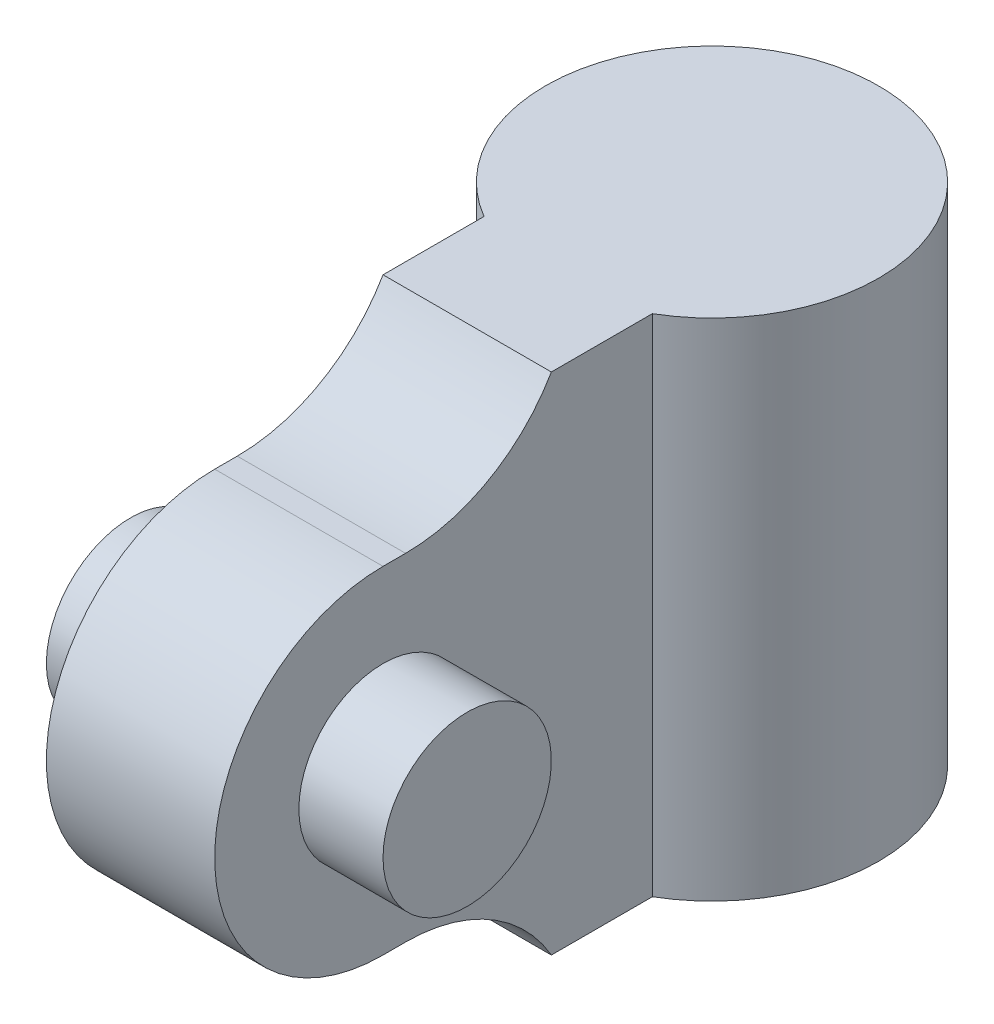
ISO-10303-21;
HEADER;
FILE_DESCRIPTION(('STEP AP214'),'2;1');
FILE_NAME('part.step','',(''),(''),'','','');
FILE_SCHEMA(('AUTOMOTIVE_DESIGN { 1 0 10303 214 1 1 1 1 }'));
ENDSEC;
DATA;
#1=APPLICATION_CONTEXT('core data for automotive mechanical design processes');
#2=APPLICATION_PROTOCOL_DEFINITION('international standard','automotive_design',2000,#1);
#3=PRODUCT_CONTEXT('',#1,'mechanical');
#4=PRODUCT('Part','Part','',(#3));
#5=PRODUCT_RELATED_PRODUCT_CATEGORY('part','',(#4));
#6=PRODUCT_DEFINITION_FORMATION('','',#4);
#7=PRODUCT_DEFINITION_CONTEXT('part definition',#1,'design');
#8=PRODUCT_DEFINITION('design','',#6,#7);
#9=PRODUCT_DEFINITION_SHAPE('','',#8);
#10=(LENGTH_UNIT() NAMED_UNIT(*) SI_UNIT(.MILLI.,.METRE.));
#11=(NAMED_UNIT(*) PLANE_ANGLE_UNIT() SI_UNIT($,.RADIAN.));
#12=(NAMED_UNIT(*) SI_UNIT($,.STERADIAN.) SOLID_ANGLE_UNIT());
#13=UNCERTAINTY_MEASURE_WITH_UNIT(LENGTH_MEASURE(1.E-05),#10,'distance_accuracy_value','');
#14=(GEOMETRIC_REPRESENTATION_CONTEXT(3) GLOBAL_UNCERTAINTY_ASSIGNED_CONTEXT((#13)) GLOBAL_UNIT_ASSIGNED_CONTEXT((#10,
#11,#12)) REPRESENTATION_CONTEXT('',''));
#15=CARTESIAN_POINT('',(0.,0.,0.));
#16=DIRECTION('',(0.,0.,1.));
#17=DIRECTION('',(1.,0.,0.));
#18=AXIS2_PLACEMENT_3D('',#15,#16,#17);
#19=CARTESIAN_POINT('',(-2.5,-15.,5.7722944655068));
#20=DIRECTION('',(-1.,0.,0.));
#21=DIRECTION('',(0.,0.,1.));
#22=AXIS2_PLACEMENT_3D('',#19,#20,#21);
#23=PLANE('',#22);
#24=CARTESIAN_POINT('',(-2.5,-7.5,12.2722944655068));
#25=DIRECTION('',(-1.,0.,0.));
#26=DIRECTION('',(0.,0.,1.));
#27=AXIS2_PLACEMENT_3D('',#24,#25,#26);
#28=CIRCLE('',#27,2.5);
#29=CARTESIAN_POINT('',(-2.5,-7.5,14.7722944655068));
#30=VERTEX_POINT('',#29);
#31=EDGE_CURVE('E53',#30,#30,#28,.T.);
#32=ORIENTED_EDGE('',*,*,#31,.F.);
#33=EDGE_LOOP('',(#32));
#34=FACE_BOUND('',#33,.T.);
#35=DIRECTION('',(0.,0.,-1.));
#36=VECTOR('',#35,1.);
#37=CARTESIAN_POINT('',(-2.5,-12.5,17.2722944655068));
#38=LINE('',#37,#36);
#39=CARTESIAN_POINT('',(-2.5,-12.5,12.2722944655068));
#40=VERTEX_POINT('',#39);
#41=CARTESIAN_POINT('',(-2.5,-12.5,11.602421484429));
#42=VERTEX_POINT('',#41);
#43=EDGE_CURVE('E60',#40,#42,#38,.T.);
#44=ORIENTED_EDGE('',*,*,#43,.F.);
#45=CARTESIAN_POINT('',(-2.5,-7.5,12.2722944655068));
#46=DIRECTION('',(-1.,0.,0.));
#47=DIRECTION('',(0.,0.,1.));
#48=AXIS2_PLACEMENT_3D('',#45,#46,#47);
#49=CIRCLE('',#48,5.);
#50=CARTESIAN_POINT('',(-2.5,-2.5,12.2722944655068));
#51=VERTEX_POINT('',#50);
#52=EDGE_CURVE('E65',#40,#51,#49,.T.);
#53=ORIENTED_EDGE('',*,*,#52,.T.);
#54=DIRECTION('',(0.,0.,-1.));
#55=VECTOR('',#54,1.);
#56=CARTESIAN_POINT('',(-2.5,-2.5,17.2722944655068));
#57=LINE('',#56,#55);
#58=CARTESIAN_POINT('',(-2.5,-2.5,11.602421484429));
#59=VERTEX_POINT('',#58);
#60=EDGE_CURVE('E125',#51,#59,#57,.T.);
#61=ORIENTED_EDGE('',*,*,#60,.T.);
#62=CARTESIAN_POINT('',(-2.5,2.5,11.602421484429));
#63=DIRECTION('',(-1.,0.,0.));
#64=DIRECTION('',(0.,0.,1.));
#65=AXIS2_PLACEMENT_3D('',#62,#63,#64);
#66=CIRCLE('',#65,5.);
#67=CARTESIAN_POINT('',(-2.5,0.,7.2722944655068));
#68=VERTEX_POINT('',#67);
#69=EDGE_CURVE('E278',#59,#68,#66,.F.);
#70=ORIENTED_EDGE('',*,*,#69,.T.);
#71=DIRECTION('',(0.,0.,1.));
#72=VECTOR('',#71,1.);
#73=CARTESIAN_POINT('',(-2.5,0.,5.7722944655068));
#74=LINE('',#73,#72);
#75=CARTESIAN_POINT('',(-2.5,0.,4.27229446550679));
#76=VERTEX_POINT('',#75);
#77=EDGE_CURVE('E281',#76,#68,#74,.T.);
#78=ORIENTED_EDGE('',*,*,#77,.F.);
#79=DIRECTION('',(0.,1.,0.));
#80=VECTOR('',#79,1.);
#81=CARTESIAN_POINT('',(-2.5,-15.,4.27229446550679));
#82=LINE('',#81,#80);
#83=CARTESIAN_POINT('',(-2.5,-15.,4.27229446550679));
#84=VERTEX_POINT('',#83);
#85=EDGE_CURVE('E286',#84,#76,#82,.T.);
#86=ORIENTED_EDGE('',*,*,#85,.F.);
#87=DIRECTION('',(0.,0.,1.));
#88=VECTOR('',#87,1.);
#89=CARTESIAN_POINT('',(-2.5,-15.,5.7722944655068));
#90=LINE('',#89,#88);
#91=CARTESIAN_POINT('',(-2.5,-15.,7.2722944655068));
#92=VERTEX_POINT('',#91);
#93=EDGE_CURVE('E290',#84,#92,#90,.T.);
#94=ORIENTED_EDGE('',*,*,#93,.T.);
#95=CARTESIAN_POINT('',(-2.5,-17.5,11.602421484429));
#96=DIRECTION('',(-1.,0.,0.));
#97=DIRECTION('',(0.,0.,1.));
#98=AXIS2_PLACEMENT_3D('',#95,#96,#97);
#99=CIRCLE('',#98,5.);
#100=EDGE_CURVE('E301',#92,#42,#99,.F.);
#101=ORIENTED_EDGE('',*,*,#100,.T.);
#102=EDGE_LOOP('',(#44,#53,#61,#70,#78,#86,#94,#101));
#103=FACE_BOUND('',#102,.T.);
#104=ADVANCED_FACE('F46',(#34,#103),#23,.T.);
#105=CARTESIAN_POINT('',(0.,-15.,0.));
#106=DIRECTION('',(0.,1.,0.));
#107=DIRECTION('',(0.,0.,1.));
#108=AXIS2_PLACEMENT_3D('',#105,#106,#107);
#109=CYLINDRICAL_SURFACE('',#108,4.95);
#110=CARTESIAN_POINT('',(0.,0.,0.));
#111=DIRECTION('',(0.,-1.,0.));
#112=DIRECTION('',(0.,0.,-1.));
#113=AXIS2_PLACEMENT_3D('',#110,#111,#112);
#114=CIRCLE('',#113,4.95);
#115=CARTESIAN_POINT('',(2.5,0.,4.27229446550679));
#116=VERTEX_POINT('',#115);
#117=EDGE_CURVE('E298',#76,#116,#114,.T.);
#118=ORIENTED_EDGE('',*,*,#117,.T.);
#119=DIRECTION('',(0.,1.,0.));
#120=VECTOR('',#119,1.);
#121=CARTESIAN_POINT('',(2.5,-15.,4.27229446550679));
#122=LINE('',#121,#120);
#123=CARTESIAN_POINT('',(2.5,-15.,4.27229446550679));
#124=VERTEX_POINT('',#123);
#125=EDGE_CURVE('E142',#124,#116,#122,.T.);
#126=ORIENTED_EDGE('',*,*,#125,.F.);
#127=CARTESIAN_POINT('',(0.,-15.,0.));
#128=DIRECTION('',(0.,-1.,0.));
#129=DIRECTION('',(0.,0.,-1.));
#130=AXIS2_PLACEMENT_3D('',#127,#128,#129);
#131=CIRCLE('',#130,4.95);
#132=EDGE_CURVE('E135',#84,#124,#131,.T.);
#133=ORIENTED_EDGE('',*,*,#132,.F.);
#134=ORIENTED_EDGE('',*,*,#85,.T.);
#135=EDGE_LOOP('',(#118,#126,#133,#134));
#136=FACE_BOUND('',#135,.T.);
#137=ADVANCED_FACE('F179',(#136),#109,.T.);
#138=CARTESIAN_POINT('',(2.5,-15.,5.7722944655068));
#139=DIRECTION('',(1.,0.,0.));
#140=DIRECTION('',(0.,0.,-1.));
#141=AXIS2_PLACEMENT_3D('',#138,#139,#140);
#142=PLANE('',#141);
#143=CARTESIAN_POINT('',(2.5,-7.5,12.2722944655068));
#144=DIRECTION('',(1.,0.,0.));
#145=DIRECTION('',(0.,0.,-1.));
#146=AXIS2_PLACEMENT_3D('',#143,#144,#145);
#147=CIRCLE('',#146,2.5);
#148=CARTESIAN_POINT('',(2.5,-7.5,9.7722944655068));
#149=VERTEX_POINT('',#148);
#150=EDGE_CURVE('E12',#149,#149,#147,.T.);
#151=ORIENTED_EDGE('',*,*,#150,.F.);
#152=EDGE_LOOP('',(#151));
#153=FACE_BOUND('',#152,.T.);
#154=CARTESIAN_POINT('',(2.5,-7.5,12.2722944655068));
#155=DIRECTION('',(1.,0.,0.));
#156=DIRECTION('',(0.,0.,-1.));
#157=AXIS2_PLACEMENT_3D('',#154,#155,#156);
#158=CIRCLE('',#157,5.);
#159=CARTESIAN_POINT('',(2.5,-2.5,12.2722944655068));
#160=VERTEX_POINT('',#159);
#161=CARTESIAN_POINT('',(2.5,-12.5,12.2722944655068));
#162=VERTEX_POINT('',#161);
#163=EDGE_CURVE('E112',#160,#162,#158,.T.);
#164=ORIENTED_EDGE('',*,*,#163,.T.);
#165=DIRECTION('',(0.,0.,-1.));
#166=VECTOR('',#165,1.);
#167=CARTESIAN_POINT('',(2.5,-12.5,17.2722944655068));
#168=LINE('',#167,#166);
#169=CARTESIAN_POINT('',(2.5,-12.5,11.602421484429));
#170=VERTEX_POINT('',#169);
#171=EDGE_CURVE('E136',#162,#170,#168,.T.);
#172=ORIENTED_EDGE('',*,*,#171,.T.);
#173=CARTESIAN_POINT('',(2.5,-17.5,11.602421484429));
#174=DIRECTION('',(1.,0.,0.));
#175=DIRECTION('',(0.,0.,-1.));
#176=AXIS2_PLACEMENT_3D('',#173,#174,#175);
#177=CIRCLE('',#176,5.);
#178=CARTESIAN_POINT('',(2.5,-15.,7.2722944655068));
#179=VERTEX_POINT('',#178);
#180=EDGE_CURVE('E144',#170,#179,#177,.F.);
#181=ORIENTED_EDGE('',*,*,#180,.T.);
#182=DIRECTION('',(0.,0.,-1.));
#183=VECTOR('',#182,1.);
#184=CARTESIAN_POINT('',(2.5,-15.,5.7722944655068));
#185=LINE('',#184,#183);
#186=EDGE_CURVE('E267',#179,#124,#185,.T.);
#187=ORIENTED_EDGE('',*,*,#186,.T.);
#188=ORIENTED_EDGE('',*,*,#125,.T.);
#189=DIRECTION('',(0.,0.,-1.));
#190=VECTOR('',#189,1.);
#191=CARTESIAN_POINT('',(2.5,0.,5.7722944655068));
#192=LINE('',#191,#190);
#193=CARTESIAN_POINT('',(2.5,0.,7.2722944655068));
#194=VERTEX_POINT('',#193);
#195=EDGE_CURVE('E262',#194,#116,#192,.T.);
#196=ORIENTED_EDGE('',*,*,#195,.F.);
#197=CARTESIAN_POINT('',(2.5,2.5,11.602421484429));
#198=DIRECTION('',(1.,0.,0.));
#199=DIRECTION('',(0.,0.,-1.));
#200=AXIS2_PLACEMENT_3D('',#197,#198,#199);
#201=CIRCLE('',#200,5.);
#202=CARTESIAN_POINT('',(2.5,-2.5,11.602421484429));
#203=VERTEX_POINT('',#202);
#204=EDGE_CURVE('E115',#194,#203,#201,.F.);
#205=ORIENTED_EDGE('',*,*,#204,.T.);
#206=DIRECTION('',(0.,0.,-1.));
#207=VECTOR('',#206,1.);
#208=CARTESIAN_POINT('',(2.5,-2.5,17.2722944655068));
#209=LINE('',#208,#207);
#210=EDGE_CURVE('E108',#160,#203,#209,.T.);
#211=ORIENTED_EDGE('',*,*,#210,.F.);
#212=EDGE_LOOP('',(#164,#172,#181,#187,#188,#196,#205,#211));
#213=FACE_BOUND('',#212,.T.);
#214=ADVANCED_FACE('F110',(#153,#213),#142,.T.);
#215=CARTESIAN_POINT('',(0.,-15.,1.1611472327534));
#216=DIRECTION('',(0.,-1.,0.));
#217=DIRECTION('',(1.,0.,0.));
#218=AXIS2_PLACEMENT_3D('',#215,#216,#217);
#219=PLANE('',#218);
#220=ORIENTED_EDGE('',*,*,#93,.F.);
#221=ORIENTED_EDGE('',*,*,#132,.T.);
#222=ORIENTED_EDGE('',*,*,#186,.F.);
#223=DIRECTION('',(1.,0.,0.));
#224=VECTOR('',#223,1.);
#225=CARTESIAN_POINT('',(0.,-15.,7.2722944655068));
#226=LINE('',#225,#224);
#227=EDGE_CURVE('E120',#92,#179,#226,.T.);
#228=ORIENTED_EDGE('',*,*,#227,.F.);
#229=EDGE_LOOP('',(#220,#221,#222,#228));
#230=FACE_BOUND('',#229,.T.);
#231=ADVANCED_FACE('F187',(#230),#219,.T.);
#232=CARTESIAN_POINT('',(0.,0.,1.1611472327534));
#233=DIRECTION('',(0.,-1.,0.));
#234=DIRECTION('',(1.,0.,0.));
#235=AXIS2_PLACEMENT_3D('',#232,#233,#234);
#236=PLANE('',#235);
#237=ORIENTED_EDGE('',*,*,#77,.T.);
#238=DIRECTION('',(1.,0.,0.));
#239=VECTOR('',#238,1.);
#240=CARTESIAN_POINT('',(0.,0.,7.2722944655068));
#241=LINE('',#240,#239);
#242=EDGE_CURVE('E252',#68,#194,#241,.T.);
#243=ORIENTED_EDGE('',*,*,#242,.T.);
#244=ORIENTED_EDGE('',*,*,#195,.T.);
#245=ORIENTED_EDGE('',*,*,#117,.F.);
#246=EDGE_LOOP('',(#237,#243,#244,#245));
#247=FACE_BOUND('',#246,.T.);
#248=ADVANCED_FACE('F193',(#247),#236,.F.);
#249=CARTESIAN_POINT('',(0.,-2.5,17.2722944655068));
#250=DIRECTION('',(0.,1.,0.));
#251=DIRECTION('',(0.,0.,1.));
#252=AXIS2_PLACEMENT_3D('',#249,#250,#251);
#253=PLANE('',#252);
#254=ORIENTED_EDGE('',*,*,#210,.T.);
#255=DIRECTION('',(-1.,0.,0.));
#256=VECTOR('',#255,1.);
#257=CARTESIAN_POINT('',(-2.5,-2.5,11.602421484429));
#258=LINE('',#257,#256);
#259=EDGE_CURVE('E128',#203,#59,#258,.T.);
#260=ORIENTED_EDGE('',*,*,#259,.T.);
#261=ORIENTED_EDGE('',*,*,#60,.F.);
#262=DIRECTION('',(1.,0.,0.));
#263=VECTOR('',#262,1.);
#264=CARTESIAN_POINT('',(0.,-2.5,12.2722944655068));
#265=LINE('',#264,#263);
#266=EDGE_CURVE('E123',#51,#160,#265,.T.);
#267=ORIENTED_EDGE('',*,*,#266,.T.);
#268=EDGE_LOOP('',(#254,#260,#261,#267));
#269=FACE_BOUND('',#268,.T.);
#270=ADVANCED_FACE('F124',(#269),#253,.T.);
#271=CARTESIAN_POINT('',(0.,-12.5,17.2722944655068));
#272=DIRECTION('',(0.,1.,0.));
#273=DIRECTION('',(0.,0.,1.));
#274=AXIS2_PLACEMENT_3D('',#271,#272,#273);
#275=PLANE('',#274);
#276=ORIENTED_EDGE('',*,*,#43,.T.);
#277=DIRECTION('',(1.,0.,0.));
#278=VECTOR('',#277,1.);
#279=CARTESIAN_POINT('',(0.,-12.5,11.602421484429));
#280=LINE('',#279,#278);
#281=EDGE_CURVE('E129',#42,#170,#280,.T.);
#282=ORIENTED_EDGE('',*,*,#281,.T.);
#283=ORIENTED_EDGE('',*,*,#171,.F.);
#284=DIRECTION('',(1.,0.,0.));
#285=VECTOR('',#284,1.);
#286=CARTESIAN_POINT('',(-2.5,-12.5,12.2722944655068));
#287=LINE('',#286,#285);
#288=EDGE_CURVE('E133',#162,#40,#287,.F.);
#289=ORIENTED_EDGE('',*,*,#288,.T.);
#290=EDGE_LOOP('',(#276,#282,#283,#289));
#291=FACE_BOUND('',#290,.T.);
#292=ADVANCED_FACE('F200',(#291),#275,.F.);
#293=CARTESIAN_POINT('',(0.,-17.5,11.602421484429));
#294=DIRECTION('',(1.,0.,0.));
#295=DIRECTION('',(0.,0.,-1.));
#296=AXIS2_PLACEMENT_3D('',#293,#294,#295);
#297=CYLINDRICAL_SURFACE('',#296,5.);
#298=ORIENTED_EDGE('',*,*,#100,.F.);
#299=ORIENTED_EDGE('',*,*,#227,.T.);
#300=ORIENTED_EDGE('',*,*,#180,.F.);
#301=ORIENTED_EDGE('',*,*,#281,.F.);
#302=EDGE_LOOP('',(#298,#299,#300,#301));
#303=FACE_BOUND('',#302,.T.);
#304=ADVANCED_FACE('F203',(#303),#297,.F.);
#305=CARTESIAN_POINT('',(0.,2.5,11.602421484429));
#306=DIRECTION('',(1.,0.,0.));
#307=DIRECTION('',(0.,0.,-1.));
#308=AXIS2_PLACEMENT_3D('',#305,#306,#307);
#309=CYLINDRICAL_SURFACE('',#308,5.);
#310=ORIENTED_EDGE('',*,*,#69,.F.);
#311=ORIENTED_EDGE('',*,*,#259,.F.);
#312=ORIENTED_EDGE('',*,*,#204,.F.);
#313=ORIENTED_EDGE('',*,*,#242,.F.);
#314=EDGE_LOOP('',(#310,#311,#312,#313));
#315=FACE_BOUND('',#314,.T.);
#316=ADVANCED_FACE('F207',(#315),#309,.F.);
#317=CARTESIAN_POINT('',(0.,-7.5,12.2722944655068));
#318=DIRECTION('',(1.,0.,0.));
#319=DIRECTION('',(0.,0.,-1.));
#320=AXIS2_PLACEMENT_3D('',#317,#318,#319);
#321=CYLINDRICAL_SURFACE('',#320,5.);
#322=ORIENTED_EDGE('',*,*,#266,.F.);
#323=ORIENTED_EDGE('',*,*,#52,.F.);
#324=ORIENTED_EDGE('',*,*,#288,.F.);
#325=ORIENTED_EDGE('',*,*,#163,.F.);
#326=EDGE_LOOP('',(#322,#323,#324,#325));
#327=FACE_BOUND('',#326,.T.);
#328=ADVANCED_FACE('F132',(#327),#321,.T.);
#329=CARTESIAN_POINT('',(-2.5,-7.5,12.2722944655068));
#330=DIRECTION('',(-1.,0.,0.));
#331=DIRECTION('',(0.,0.,1.));
#332=AXIS2_PLACEMENT_3D('',#329,#330,#331);
#333=CYLINDRICAL_SURFACE('',#332,2.5);
#334=ORIENTED_EDGE('',*,*,#31,.T.);
#335=EDGE_LOOP('',(#334));
#336=FACE_BOUND('',#335,.T.);
#337=CARTESIAN_POINT('',(-5.,-7.5,12.2722944655068));
#338=DIRECTION('',(-1.,0.,0.));
#339=DIRECTION('',(0.,0.,1.));
#340=AXIS2_PLACEMENT_3D('',#337,#338,#339);
#341=CIRCLE('',#340,2.5);
#342=CARTESIAN_POINT('',(-5.,-7.5,14.7722944655068));
#343=VERTEX_POINT('',#342);
#344=EDGE_CURVE('E232',#343,#343,#341,.T.);
#345=ORIENTED_EDGE('',*,*,#344,.F.);
#346=EDGE_LOOP('',(#345));
#347=FACE_BOUND('',#346,.T.);
#348=ADVANCED_FACE('F175',(#336,#347),#333,.T.);
#349=CARTESIAN_POINT('',(-5.,-7.5,12.2722944655068));
#350=DIRECTION('',(-1.,0.,0.));
#351=DIRECTION('',(0.,0.,1.));
#352=AXIS2_PLACEMENT_3D('',#349,#350,#351);
#353=PLANE('',#352);
#354=ORIENTED_EDGE('',*,*,#344,.T.);
#355=EDGE_LOOP('',(#354));
#356=FACE_BOUND('',#355,.T.);
#357=ADVANCED_FACE('F216',(#356),#353,.T.);
#358=CARTESIAN_POINT('',(5.,-7.5,12.2722944655068));
#359=DIRECTION('',(-1.,0.,0.));
#360=DIRECTION('',(0.,0.,1.));
#361=AXIS2_PLACEMENT_3D('',#358,#359,#360);
#362=CYLINDRICAL_SURFACE('',#361,2.5);
#363=CARTESIAN_POINT('',(5.,-7.5,12.2722944655068));
#364=DIRECTION('',(-1.,0.,0.));
#365=DIRECTION('',(0.,0.,1.));
#366=AXIS2_PLACEMENT_3D('',#363,#364,#365);
#367=CIRCLE('',#366,2.5);
#368=CARTESIAN_POINT('',(5.,-7.5,14.7722944655068));
#369=VERTEX_POINT('',#368);
#370=EDGE_CURVE('E231',#369,#369,#367,.T.);
#371=ORIENTED_EDGE('',*,*,#370,.T.);
#372=EDGE_LOOP('',(#371));
#373=FACE_BOUND('',#372,.T.);
#374=ORIENTED_EDGE('',*,*,#150,.T.);
#375=EDGE_LOOP('',(#374));
#376=FACE_BOUND('',#375,.T.);
#377=ADVANCED_FACE('F219',(#373,#376),#362,.T.);
#378=CARTESIAN_POINT('',(5.,-5.,12.2722944655068));
#379=DIRECTION('',(1.,0.,0.));
#380=DIRECTION('',(0.,0.,-1.));
#381=AXIS2_PLACEMENT_3D('',#378,#379,#380);
#382=PLANE('',#381);
#383=ORIENTED_EDGE('',*,*,#370,.F.);
#384=EDGE_LOOP('',(#383));
#385=FACE_BOUND('',#384,.T.);
#386=ADVANCED_FACE('F223',(#385),#382,.T.);
#387=CLOSED_SHELL('',(#104,#137,#214,#231,#248,#270,#292,#304,#316,#328,#348,#357,#377,#386));
#388=MANIFOLD_SOLID_BREP('B2',#387);
#389=ADVANCED_BREP_SHAPE_REPRESENTATION('',(#18,#388),#14);
#390=SHAPE_DEFINITION_REPRESENTATION(#9,#389);
ENDSEC;
END-ISO-10303-21;
